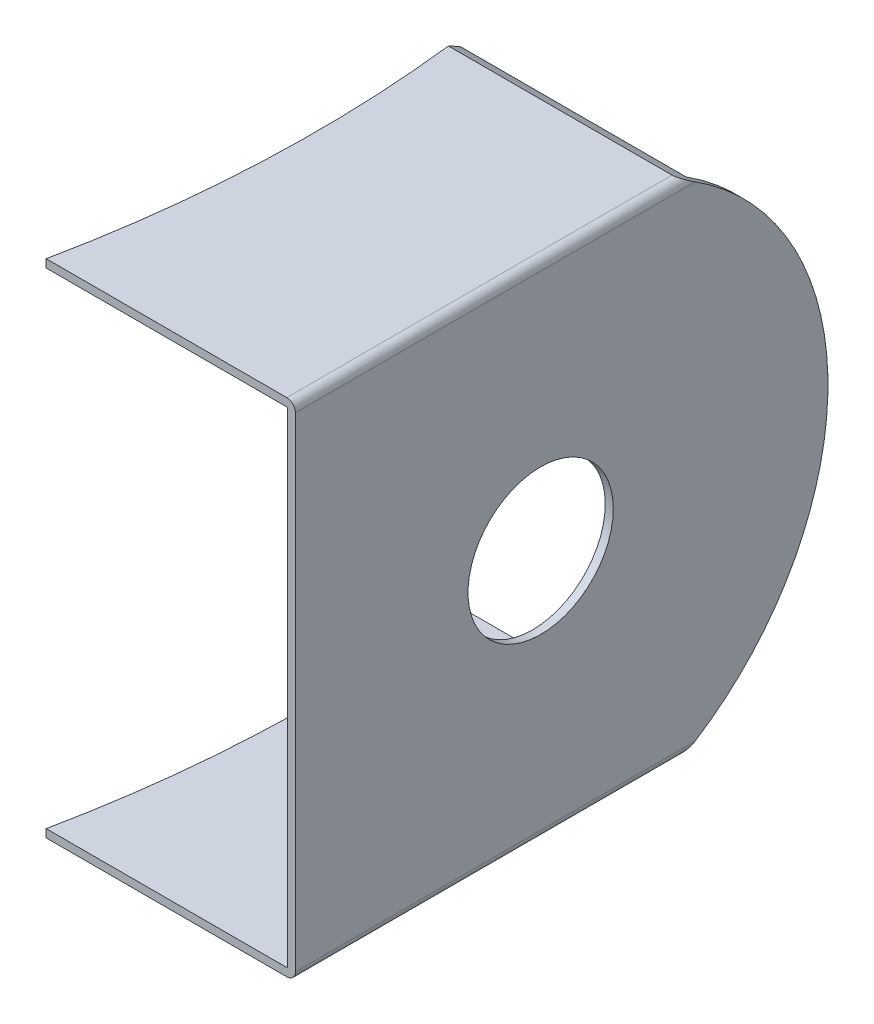
ISO-10303-21;
HEADER;
FILE_DESCRIPTION(('STEP AP214'),'2;1');
FILE_NAME('part.step','',(''),(''),'','','');
FILE_SCHEMA(('AUTOMOTIVE_DESIGN { 1 0 10303 214 1 1 1 1 }'));
ENDSEC;
DATA;
#1=APPLICATION_CONTEXT('core data for automotive mechanical design processes');
#2=APPLICATION_PROTOCOL_DEFINITION('international standard','automotive_design',2000,#1);
#3=PRODUCT_CONTEXT('',#1,'mechanical');
#4=PRODUCT('Part','Part','',(#3));
#5=PRODUCT_RELATED_PRODUCT_CATEGORY('part','',(#4));
#6=PRODUCT_DEFINITION_FORMATION('','',#4);
#7=PRODUCT_DEFINITION_CONTEXT('part definition',#1,'design');
#8=PRODUCT_DEFINITION('design','',#6,#7);
#9=PRODUCT_DEFINITION_SHAPE('','',#8);
#10=(LENGTH_UNIT() NAMED_UNIT(*) SI_UNIT(.MILLI.,.METRE.));
#11=(NAMED_UNIT(*) PLANE_ANGLE_UNIT() SI_UNIT($,.RADIAN.));
#12=(NAMED_UNIT(*) SI_UNIT($,.STERADIAN.) SOLID_ANGLE_UNIT());
#13=UNCERTAINTY_MEASURE_WITH_UNIT(LENGTH_MEASURE(1.E-05),#10,'distance_accuracy_value','');
#14=(GEOMETRIC_REPRESENTATION_CONTEXT(3) GLOBAL_UNCERTAINTY_ASSIGNED_CONTEXT((#13)) GLOBAL_UNIT_ASSIGNED_CONTEXT((#10,
#11,#12)) REPRESENTATION_CONTEXT('',''));
#15=CARTESIAN_POINT('',(0.,0.,0.));
#16=DIRECTION('',(0.,0.,1.));
#17=DIRECTION('',(1.,0.,0.));
#18=AXIS2_PLACEMENT_3D('',#15,#16,#17);
#19=CARTESIAN_POINT('',(-2.5,0.,0.));
#20=DIRECTION('',(-1.,0.,0.));
#21=DIRECTION('',(0.,0.,1.));
#22=AXIS2_PLACEMENT_3D('',#19,#20,#21);
#23=PLANE('',#22);
#24=CARTESIAN_POINT('',(-2.5,0.,-265.));
#25=DIRECTION('',(-1.,0.,0.));
#26=DIRECTION('',(0.,0.,1.));
#27=AXIS2_PLACEMENT_3D('',#24,#25,#26);
#28=CIRCLE('',#27,22.5);
#29=CARTESIAN_POINT('',(-2.5,0.,-242.5));
#30=VERTEX_POINT('',#29);
#31=EDGE_CURVE('E207',#30,#30,#28,.T.);
#32=ORIENTED_EDGE('',*,*,#31,.F.);
#33=EDGE_LOOP('',(#32));
#34=FACE_BOUND('',#33,.T.);
#35=CARTESIAN_POINT('',(-2.5,0.,-265.));
#36=DIRECTION('',(-1.,0.,0.));
#37=DIRECTION('',(0.,0.,1.));
#38=AXIS2_PLACEMENT_3D('',#35,#36,#37);
#39=CIRCLE('',#38,89.);
#40=CARTESIAN_POINT('',(-2.5,-75.,-312.916594202844));
#41=VERTEX_POINT('',#40);
#42=CARTESIAN_POINT('',(-2.5,75.,-312.916594202844));
#43=VERTEX_POINT('',#42);
#44=EDGE_CURVE('E286',#41,#43,#39,.F.);
#45=ORIENTED_EDGE('',*,*,#44,.F.);
#46=DIRECTION('',(0.,0.,-1.));
#47=VECTOR('',#46,1.);
#48=CARTESIAN_POINT('',(-2.5,-75.,365.));
#49=LINE('',#48,#47);
#50=CARTESIAN_POINT('',(-2.5,-75.,-189.039471801476));
#51=VERTEX_POINT('',#50);
#52=EDGE_CURVE('E234',#51,#41,#49,.T.);
#53=ORIENTED_EDGE('',*,*,#52,.F.);
#54=DIRECTION('',(0.,-1.,0.));
#55=VECTOR('',#54,1.);
#56=CARTESIAN_POINT('',(-2.5,0.,-189.039471801476));
#57=LINE('',#56,#55);
#58=CARTESIAN_POINT('',(-2.5,75.,-189.039471801476));
#59=VERTEX_POINT('',#58);
#60=EDGE_CURVE('E365',#59,#51,#57,.T.);
#61=ORIENTED_EDGE('',*,*,#60,.F.);
#62=DIRECTION('',(0.,0.,1.));
#63=VECTOR('',#62,1.);
#64=CARTESIAN_POINT('',(-2.5,75.,365.));
#65=LINE('',#64,#63);
#66=EDGE_CURVE('E231',#43,#59,#65,.T.);
#67=ORIENTED_EDGE('',*,*,#66,.F.);
#68=EDGE_LOOP('',(#45,#53,#61,#67));
#69=FACE_BOUND('',#68,.T.);
#70=ADVANCED_FACE('F82',(#34,#69),#23,.T.);
#71=CARTESIAN_POINT('',(0.,0.,0.));
#72=DIRECTION('',(-1.,0.,0.));
#73=DIRECTION('',(0.,0.,1.));
#74=AXIS2_PLACEMENT_3D('',#71,#72,#73);
#75=PLANE('',#74);
#76=CARTESIAN_POINT('',(0.,0.,-265.));
#77=DIRECTION('',(1.,0.,0.));
#78=DIRECTION('',(0.,0.,-1.));
#79=AXIS2_PLACEMENT_3D('',#76,#77,#78);
#80=CIRCLE('',#79,22.5);
#81=CARTESIAN_POINT('',(0.,0.,-287.5));
#82=VERTEX_POINT('',#81);
#83=EDGE_CURVE('E201',#82,#82,#80,.T.);
#84=ORIENTED_EDGE('',*,*,#83,.F.);
#85=EDGE_LOOP('',(#84));
#86=FACE_BOUND('',#85,.T.);
#87=DIRECTION('',(0.,0.,-1.));
#88=VECTOR('',#87,1.);
#89=CARTESIAN_POINT('',(0.,-75.,365.));
#90=LINE('',#89,#88);
#91=CARTESIAN_POINT('',(0.,-75.,-189.039471801476));
#92=VERTEX_POINT('',#91);
#93=CARTESIAN_POINT('',(0.,-75.,-312.916594202844));
#94=VERTEX_POINT('',#93);
#95=EDGE_CURVE('E235',#92,#94,#90,.T.);
#96=ORIENTED_EDGE('',*,*,#95,.T.);
#97=CARTESIAN_POINT('',(0.,0.,-265.));
#98=DIRECTION('',(-1.,0.,0.));
#99=DIRECTION('',(0.,0.,1.));
#100=AXIS2_PLACEMENT_3D('',#97,#98,#99);
#101=CIRCLE('',#100,89.);
#102=CARTESIAN_POINT('',(0.,75.,-312.916594202844));
#103=VERTEX_POINT('',#102);
#104=EDGE_CURVE('E302',#94,#103,#101,.F.);
#105=ORIENTED_EDGE('',*,*,#104,.T.);
#106=DIRECTION('',(0.,0.,1.));
#107=VECTOR('',#106,1.);
#108=CARTESIAN_POINT('',(0.,75.,365.));
#109=LINE('',#108,#107);
#110=CARTESIAN_POINT('',(0.,75.,-189.039471801476));
#111=VERTEX_POINT('',#110);
#112=EDGE_CURVE('E227',#103,#111,#109,.T.);
#113=ORIENTED_EDGE('',*,*,#112,.T.);
#114=DIRECTION('',(0.,-1.,0.));
#115=VECTOR('',#114,1.);
#116=CARTESIAN_POINT('',(0.,0.,-189.039471801476));
#117=LINE('',#116,#115);
#118=EDGE_CURVE('E209',#111,#92,#117,.T.);
#119=ORIENTED_EDGE('',*,*,#118,.T.);
#120=EDGE_LOOP('',(#96,#105,#113,#119));
#121=FACE_BOUND('',#120,.T.);
#122=ADVANCED_FACE('F84',(#86,#121),#75,.F.);
#123=CARTESIAN_POINT('',(-2.69999999999998,75.,-365.));
#124=DIRECTION('',(0.,0.,-1.));
#125=DIRECTION('',(0.,1.,0.));
#126=AXIS2_PLACEMENT_3D('',#123,#124,#125);
#127=CYLINDRICAL_SURFACE('',#126,2.70000000000001);
#128=CARTESIAN_POINT('',(-2.69999999999987,77.7,-308.401728076195));
#129=CARTESIAN_POINT('',(-2.65984174106857,77.7000054761132,-308.401717883849));
#130=CARTESIAN_POINT('',(-2.6197052814527,77.6991034412853,-308.403333172818));
#131=CARTESIAN_POINT('',(-2.53980520822532,77.6955387905893,-308.409714035789));
#132=CARTESIAN_POINT('',(-2.50004123564927,77.6928780963616,-308.414476171313));
#133=CARTESIAN_POINT('',(-2.38257877020886,77.6824174794397,-308.433192660789));
#134=CARTESIAN_POINT('',(-2.30577201693626,77.6721362371867,-308.451582221636));
#135=CARTESIAN_POINT('',(-2.13840998950562,77.6426315917734,-308.504285477607));
#136=CARTESIAN_POINT('',(-2.04902879567052,77.6218457699447,-308.541376779199));
#137=CARTESIAN_POINT('',(-1.87803547909727,77.5733886538341,-308.627649900219));
#138=CARTESIAN_POINT('',(-1.7964614321691,77.5456857783308,-308.676887161744));
#139=CARTESIAN_POINT('',(-1.59701187561448,77.4679108816823,-308.814746794419));
#140=CARTESIAN_POINT('',(-1.4850836454055,77.4141112449714,-308.9097812655));
#141=CARTESIAN_POINT('',(-1.27860490111387,77.298622782817,-309.112772265397));
#142=CARTESIAN_POINT('',(-1.18409022644403,77.2369181204062,-309.220754705645));
#143=CARTESIAN_POINT('',(-1.01593601718416,77.1128214081418,-309.436777347634));
#144=CARTESIAN_POINT('',(-0.941283618400128,77.0507984876956,-309.544253999978));
#145=CARTESIAN_POINT('',(-0.802703646058983,76.9233141028206,-309.764047137146));
#146=CARTESIAN_POINT('',(-0.738785133111483,76.8578497940605,-309.876367611201));
#147=CARTESIAN_POINT('',(-0.620156558505718,76.7240279015436,-310.104779546486));
#148=CARTESIAN_POINT('',(-0.565483953343071,76.6556598897693,-310.220884176106));
#149=CARTESIAN_POINT('',(-0.464656302995648,76.5167722720493,-310.455496572402));
#150=CARTESIAN_POINT('',(-0.418503814466665,76.4462520276506,-310.574005048607));
#151=CARTESIAN_POINT('',(-0.311470271773224,76.2653583754462,-310.87636130187));
#152=CARTESIAN_POINT('',(-0.255853419959798,76.153780447872,-311.061362462463));
#153=CARTESIAN_POINT('',(-0.161279447431635,75.9273334662262,-311.433690328185));
#154=CARTESIAN_POINT('',(-0.122333637112953,75.8124622340254,-311.621018523692));
#155=CARTESIAN_POINT('',(-0.0608930546610722,75.5822711688357,-311.99326839316));
#156=CARTESIAN_POINT('',(-0.0381096888427095,75.4669981949599,-312.178171199399));
#157=CARTESIAN_POINT('',(-0.015280622388065,75.2927502461648,-312.455386101439));
#158=CARTESIAN_POINT('',(-0.00956196895023161,75.2344821123025,-312.547708999312));
#159=CARTESIAN_POINT('',(-0.00192392878165216,75.1175346055044,-312.732252529271));
#160=CARTESIAN_POINT('',(-4.57947224899303E-06,75.0588552285237,-312.82447316034));
#161=CARTESIAN_POINT('',(0.,75.,-312.916594202844));
#162=B_SPLINE_CURVE_WITH_KNOTS('',3,(#128,#129,#130,#131,#132,#133,#134,#135,#136,#137,#138,
#139,#140,#141,#142,#143,#144,#145,#146,#147,#148,#149,#150,#151,#152,#153,#154,#155,#156,#157,
#158,#159,#160,#161),.UNSPECIFIED.,.F.,.F.,(4,2,2,2,2,2,2,2,2,2,2,2,2,2,2,2,4),(0.,
0.120392027188299,0.240652722191111,0.478401767589166,0.773717648538522,1.07040733153262,
1.53691788742699,2.00437811250785,2.4381928964731,2.87237204814076,3.30827004349655,
3.74429862815144,4.41276982819324,5.08169383358009,5.73835060599407,6.06626088806526,
6.39417439988108),.UNSPECIFIED.);
#163=CARTESIAN_POINT('',(-2.69999999999987,77.7,-308.401728076195));
#164=VERTEX_POINT('',#163);
#165=EDGE_CURVE('E377',#164,#103,#162,.T.);
#166=ORIENTED_EDGE('',*,*,#165,.F.);
#167=DIRECTION('',(0.,0.,-1.));
#168=VECTOR('',#167,1.);
#169=CARTESIAN_POINT('',(-2.69999999999998,77.7,0.));
#170=LINE('',#169,#168);
#171=CARTESIAN_POINT('',(-2.69999999999998,77.7,-189.039471801476));
#172=VERTEX_POINT('',#171);
#173=EDGE_CURVE('E224',#172,#164,#170,.T.);
#174=ORIENTED_EDGE('',*,*,#173,.F.);
#175=CARTESIAN_POINT('',(-2.69999999999998,75.,-189.039471801476));
#176=DIRECTION('',(0.,0.,-1.));
#177=DIRECTION('',(-1.,0.,0.));
#178=AXIS2_PLACEMENT_3D('',#175,#176,#177);
#179=CIRCLE('',#178,2.70000000000001);
#180=EDGE_CURVE('E199',#111,#172,#179,.F.);
#181=ORIENTED_EDGE('',*,*,#180,.F.);
#182=ORIENTED_EDGE('',*,*,#112,.F.);
#183=EDGE_LOOP('',(#166,#174,#181,#182));
#184=FACE_BOUND('',#183,.T.);
#185=ADVANCED_FACE('F263',(#184),#127,.T.);
#186=CARTESIAN_POINT('',(-2.69999999999998,75.,-365.));
#187=DIRECTION('',(0.,0.,-1.));
#188=DIRECTION('',(0.,1.,0.));
#189=AXIS2_PLACEMENT_3D('',#186,#187,#188);
#190=CYLINDRICAL_SURFACE('',#189,0.200000000000006);
#191=DIRECTION('',(0.,0.,1.));
#192=VECTOR('',#191,1.);
#193=CARTESIAN_POINT('',(-2.70000000000004,75.2,365.));
#194=LINE('',#193,#192);
#195=CARTESIAN_POINT('',(-2.69999999999998,75.2,-189.039471801476));
#196=VERTEX_POINT('',#195);
#197=CARTESIAN_POINT('',(-2.69999999999998,75.2,-312.602100793978));
#198=VERTEX_POINT('',#197);
#199=EDGE_CURVE('E221',#196,#198,#194,.F.);
#200=ORIENTED_EDGE('',*,*,#199,.T.);
#201=CARTESIAN_POINT('',(-2.69999999999998,75.2,-312.602100793978));
#202=CARTESIAN_POINT('',(-2.69356074440796,75.2000081597546,-312.602087868224));
#203=CARTESIAN_POINT('',(-2.6871405564243,75.1996894485544,-312.602591392653));
#204=CARTESIAN_POINT('',(-2.67455867211746,75.1984726704153,-312.604513548254));
#205=CARTESIAN_POINT('',(-2.66839503066849,75.1975804389451,-312.605922962146));
#206=CARTESIAN_POINT('',(-2.65507803315628,75.1950333782778,-312.60994603715));
#207=CARTESIAN_POINT('',(-2.64800964799401,75.1932530330245,-312.61275788283));
#208=CARTESIAN_POINT('',(-2.63449025806673,75.1890998537107,-312.619316232223));
#209=CARTESIAN_POINT('',(-2.62804191392262,75.1867246113549,-312.623066534994));
#210=CARTESIAN_POINT('',(-2.61271343341614,75.180225706199,-312.633325679449));
#211=CARTESIAN_POINT('',(-2.60424696089277,75.1758243962924,-312.640271859968));
#212=CARTESIAN_POINT('',(-2.58865954876163,75.1663923286703,-312.65515232309));
#213=CARTESIAN_POINT('',(-2.58154112879142,75.1613604209051,-312.663088410904));
#214=CARTESIAN_POINT('',(-2.56358560665336,75.1469889522152,-312.685745663265));
#215=CARTESIAN_POINT('',(-2.55392106470702,75.1372293574546,-312.701122776083));
#216=CARTESIAN_POINT('',(-2.53729377265142,75.1170376674919,-312.732913295105));
#217=CARTESIAN_POINT('',(-2.53034477498693,75.1066024533928,-312.749331498938));
#218=CARTESIAN_POINT('',(-2.52025623972899,75.088155668948,-312.778332866958));
#219=CARTESIAN_POINT('',(-2.51659556886051,75.0802265551514,-312.790792020566));
#220=CARTESIAN_POINT('',(-2.5104005069982,75.0642313029192,-312.815911585961));
#221=CARTESIAN_POINT('',(-2.5078668937608,75.0561650738365,-312.828572130503));
#222=CARTESIAN_POINT('',(-2.50388851599763,75.040095804099,-312.853779797852));
#223=CARTESIAN_POINT('',(-2.50242523105902,75.0320941813387,-312.86632494786));
#224=CARTESIAN_POINT('',(-2.50048416425694,75.0160623709561,-312.891446095826));
#225=CARTESIAN_POINT('',(-2.50000485825313,75.00803224684,-312.904022015821));
#226=CARTESIAN_POINT('',(-2.49999999999995,75.,-312.916594202844));
#227=B_SPLINE_CURVE_WITH_KNOTS('',3,(#201,#202,#203,#204,#205,#206,#207,#208,#209,#210,#211,
#212,#213,#214,#215,#216,#217,#218,#219,#220,#221,#222,#223,#224,#225,#226),.UNSPECIFIED.,.F.,
.F.,(4,2,2,2,2,2,2,2,2,2,2,2,4),(0.,0.0192593530396621,0.0383257824187626,0.061634966784451,
0.085040082591011,0.120248878276498,0.155522846677884,0.217035299640928,0.278855356017726,
0.324455511713964,0.370087086392443,0.414909084578553,0.459661602905179),.UNSPECIFIED.);
#228=EDGE_CURVE('E276',#198,#43,#227,.T.);
#229=ORIENTED_EDGE('',*,*,#228,.T.);
#230=ORIENTED_EDGE('',*,*,#66,.T.);
#231=CARTESIAN_POINT('',(-2.69999999999998,75.,-189.039471801476));
#232=DIRECTION('',(0.,0.,-1.));
#233=DIRECTION('',(-1.,0.,0.));
#234=AXIS2_PLACEMENT_3D('',#231,#232,#233);
#235=CIRCLE('',#234,0.200000000000006);
#236=EDGE_CURVE('E361',#59,#196,#235,.F.);
#237=ORIENTED_EDGE('',*,*,#236,.T.);
#238=EDGE_LOOP('',(#200,#229,#230,#237));
#239=FACE_BOUND('',#238,.T.);
#240=ADVANCED_FACE('F268',(#239),#190,.F.);
#241=CARTESIAN_POINT('',(2.77555756156289E-13,77.7,0.));
#242=DIRECTION('',(0.,1.,0.));
#243=DIRECTION('',(-1.,0.,0.));
#244=AXIS2_PLACEMENT_3D('',#241,#242,#243);
#245=PLANE('',#244);
#246=CARTESIAN_POINT('',(-445.980375294033,77.7000000000016,-265.));
#247=DIRECTION('',(0.,1.,0.));
#248=DIRECTION('',(-1.,0.,0.));
#249=AXIS2_PLACEMENT_3D('',#246,#247,#248);
#250=CIRCLE('',#249,376.5);
#251=CARTESIAN_POINT('',(-77.2226660108217,77.7000000000003,-189.039471801476));
#252=VERTEX_POINT('',#251);
#253=CARTESIAN_POINT('',(-71.9903486890443,77.7000000000004,-308.401728076195));
#254=VERTEX_POINT('',#253);
#255=EDGE_CURVE('E111',#252,#254,#250,.T.);
#256=ORIENTED_EDGE('',*,*,#255,.F.);
#257=DIRECTION('',(-1.,0.,0.));
#258=VECTOR('',#257,1.);
#259=CARTESIAN_POINT('',(2.77555756156289E-13,77.7,-189.039471801476));
#260=LINE('',#259,#258);
#261=EDGE_CURVE('E190',#172,#252,#260,.T.);
#262=ORIENTED_EDGE('',*,*,#261,.F.);
#263=ORIENTED_EDGE('',*,*,#173,.T.);
#264=DIRECTION('',(1.,0.,0.));
#265=VECTOR('',#264,1.);
#266=CARTESIAN_POINT('',(-130.,77.7000000000004,-308.401728076195));
#267=LINE('',#266,#265);
#268=EDGE_CURVE('E192',#254,#164,#267,.T.);
#269=ORIENTED_EDGE('',*,*,#268,.F.);
#270=EDGE_LOOP('',(#256,#262,#263,#269));
#271=FACE_BOUND('',#270,.T.);
#272=ADVANCED_FACE('F188',(#271),#245,.T.);
#273=CARTESIAN_POINT('',(2.77555756156289E-13,75.2,0.));
#274=DIRECTION('',(0.,1.,0.));
#275=DIRECTION('',(-1.,0.,0.));
#276=AXIS2_PLACEMENT_3D('',#273,#274,#275);
#277=PLANE('',#276);
#278=DIRECTION('',(-1.,0.,0.));
#279=VECTOR('',#278,1.);
#280=CARTESIAN_POINT('',(2.77555756156289E-13,75.2,-189.039471801476));
#281=LINE('',#280,#279);
#282=CARTESIAN_POINT('',(-77.2226660108217,75.2000000000003,-189.039471801476));
#283=VERTEX_POINT('',#282);
#284=EDGE_CURVE('E356',#196,#283,#281,.T.);
#285=ORIENTED_EDGE('',*,*,#284,.T.);
#286=CARTESIAN_POINT('',(-445.980375294033,75.2000000000015,-265.));
#287=DIRECTION('',(0.,1.,0.));
#288=DIRECTION('',(-1.,0.,0.));
#289=AXIS2_PLACEMENT_3D('',#286,#287,#288);
#290=CIRCLE('',#289,376.5);
#291=CARTESIAN_POINT('',(-72.5017413670035,75.2000000000004,-312.602100793977));
#292=VERTEX_POINT('',#291);
#293=EDGE_CURVE('E178',#283,#292,#290,.T.);
#294=ORIENTED_EDGE('',*,*,#293,.T.);
#295=DIRECTION('',(1.,0.,0.));
#296=VECTOR('',#295,1.);
#297=CARTESIAN_POINT('',(-130.,75.2000000000004,-312.602100793977));
#298=LINE('',#297,#296);
#299=EDGE_CURVE('E285',#292,#198,#298,.T.);
#300=ORIENTED_EDGE('',*,*,#299,.T.);
#301=ORIENTED_EDGE('',*,*,#199,.F.);
#302=EDGE_LOOP('',(#285,#294,#300,#301));
#303=FACE_BOUND('',#302,.T.);
#304=ADVANCED_FACE('F310',(#303),#277,.F.);
#305=CARTESIAN_POINT('',(-2.70000000000004,-75.,365.));
#306=DIRECTION('',(0.,0.,1.));
#307=DIRECTION('',(0.,-1.,0.));
#308=AXIS2_PLACEMENT_3D('',#305,#306,#307);
#309=CYLINDRICAL_SURFACE('',#308,2.70000000000001);
#310=CARTESIAN_POINT('',(0.,-75.,-312.916594202844));
#311=CARTESIAN_POINT('',(-5.48315406880755E-06,-75.0615534313284,-312.820249925329));
#312=CARTESIAN_POINT('',(-0.00210431795437442,-75.122913952728,-312.723797557342));
#313=CARTESIAN_POINT('',(-0.0104562440630682,-75.2451842713042,-312.530782576569));
#314=CARTESIAN_POINT('',(-0.0167094666222142,-75.3060940541792,-312.434219960396));
#315=CARTESIAN_POINT('',(-0.0416787173237418,-75.488240162083,-312.144222668999));
#316=CARTESIAN_POINT('',(-0.0666041220879884,-75.6086938358383,-311.950790694987));
#317=CARTESIAN_POINT('',(-0.133105592482818,-75.8462911155908,-311.565986057194));
#318=CARTESIAN_POINT('',(-0.17460748624585,-75.9634470106966,-311.374608068388));
#319=CARTESIAN_POINT('',(-0.275186663854173,-76.1942049589935,-310.994482796744));
#320=CARTESIAN_POINT('',(-0.334247367463818,-76.307810253563,-310.805733207225));
#321=CARTESIAN_POINT('',(-0.430480944116504,-76.4635568188196,-310.544835238964));
#322=CARTESIAN_POINT('',(-0.459480841092597,-76.507620544854,-310.470774343927));
#323=CARTESIAN_POINT('',(-0.520769433258612,-76.5949287880894,-310.323550301138));
#324=CARTESIAN_POINT('',(-0.553057851111673,-76.6381733740083,-310.250387078262));
#325=CARTESIAN_POINT('',(-0.655437985566986,-76.7668763192897,-310.031935992275));
#326=CARTESIAN_POINT('',(-0.730844021815633,-76.8509727575857,-309.888241659645));
#327=CARTESIAN_POINT('',(-0.866564745573194,-76.9833798717041,-309.660603317542));
#328=CARTESIAN_POINT('',(-0.921858204301485,-77.033233679171,-309.574548753646));
#329=CARTESIAN_POINT('',(-1.03968524628489,-77.1305406389732,-309.405958594687));
#330=CARTESIAN_POINT('',(-1.10222325104568,-77.1779922995707,-309.323425191153));
#331=CARTESIAN_POINT('',(-1.23510674144133,-77.269484805367,-309.163731030463));
#332=CARTESIAN_POINT('',(-1.30540696867531,-77.3135431191499,-309.086542997064));
#333=CARTESIAN_POINT('',(-1.4551183562792,-77.3974199950886,-308.939123103068));
#334=CARTESIAN_POINT('',(-1.53451386478091,-77.437245620045,-308.868879668609));
#335=CARTESIAN_POINT('',(-1.68909308922559,-77.5047750414191,-308.749442574968));
#336=CARTESIAN_POINT('',(-1.76266730069056,-77.5333865948939,-308.698704452017));
#337=CARTESIAN_POINT('',(-1.91724564234326,-77.5853340005455,-308.606407201778));
#338=CARTESIAN_POINT('',(-1.9982528637252,-77.6086676436716,-308.564851918102));
#339=CARTESIAN_POINT('',(-2.16853832368201,-77.6486316631693,-308.493582556169));
#340=CARTESIAN_POINT('',(-2.25791694027911,-77.665163054478,-308.464043400064));
#341=CARTESIAN_POINT('',(-2.39546994532581,-77.6831717589382,-308.43184279697));
#342=CARTESIAN_POINT('',(-2.4418416803193,-77.6880413985335,-308.423130643608));
#343=CARTESIAN_POINT('',(-2.53536496341062,-77.6953818428264,-308.409995418962));
#344=CARTESIAN_POINT('',(-2.58251587744697,-77.6978545089019,-308.405569019563));
#345=CARTESIAN_POINT('',(-2.65317358667657,-77.6996966159089,-308.402271161887));
#346=CARTESIAN_POINT('',(-2.67658943419545,-77.7000027594894,-308.40172300444));
#347=CARTESIAN_POINT('',(-2.69999999999992,-77.7,-308.401728076195));
#348=B_SPLINE_CURVE_WITH_KNOTS('',3,(#310,#311,#312,#313,#314,#315,#316,#317,#318,#319,#320,
#321,#322,#323,#324,#325,#326,#327,#328,#329,#330,#331,#332,#333,#334,#335,#336,#337,#338,#339,
#340,#341,#342,#343,#344,#345,#346,#347),.UNSPECIFIED.,.F.,.F.,(4,2,2,2,2,2,2,2,2,2,2,2,2,2,2,2,
2,2,4),(0.,0.342941922447977,0.685894680073238,1.37290877849786,2.05688265066433,
2.74021270797351,3.01293409410221,3.28563249933315,3.83305397194938,4.17418561987683,
4.51552657588794,4.85497306730466,5.19384394777072,5.47464815793358,5.75556968112389,
6.04044571129353,6.18252906909501,6.3245020029849,6.39473975055709),.UNSPECIFIED.);
#349=CARTESIAN_POINT('',(-2.69999999999992,-77.7000000000004,-308.401728076195));
#350=VERTEX_POINT('',#349);
#351=EDGE_CURVE('E293',#94,#350,#348,.T.);
#352=ORIENTED_EDGE('',*,*,#351,.F.);
#353=ORIENTED_EDGE('',*,*,#95,.F.);
#354=CARTESIAN_POINT('',(-2.70000000000004,-75.,-189.039471801476));
#355=DIRECTION('',(0.,0.,-1.));
#356=DIRECTION('',(-1.,0.,0.));
#357=AXIS2_PLACEMENT_3D('',#354,#355,#356);
#358=CIRCLE('',#357,2.70000000000001);
#359=CARTESIAN_POINT('',(-2.69999999999998,-77.7,-189.039471801476));
#360=VERTEX_POINT('',#359);
#361=EDGE_CURVE('E349',#360,#92,#358,.F.);
#362=ORIENTED_EDGE('',*,*,#361,.F.);
#363=DIRECTION('',(0.,0.,1.));
#364=VECTOR('',#363,1.);
#365=CARTESIAN_POINT('',(-2.69999999999998,-77.7,-365.));
#366=LINE('',#365,#364);
#367=EDGE_CURVE('E217',#360,#350,#366,.F.);
#368=ORIENTED_EDGE('',*,*,#367,.T.);
#369=EDGE_LOOP('',(#352,#353,#362,#368));
#370=FACE_BOUND('',#369,.T.);
#371=ADVANCED_FACE('F304',(#370),#309,.T.);
#372=CARTESIAN_POINT('',(-2.70000000000004,-75.,365.));
#373=DIRECTION('',(0.,0.,1.));
#374=DIRECTION('',(0.,-1.,0.));
#375=AXIS2_PLACEMENT_3D('',#372,#373,#374);
#376=CYLINDRICAL_SURFACE('',#375,0.200000000000006);
#377=ORIENTED_EDGE('',*,*,#52,.T.);
#378=CARTESIAN_POINT('',(-2.5,-75.,-312.916594202844));
#379=CARTESIAN_POINT('',(-2.50000814912923,-75.009084000155,-312.902375823492));
#380=CARTESIAN_POINT('',(-2.50061950746854,-75.0181663468578,-312.888150968514));
#381=CARTESIAN_POINT('',(-2.50310586748242,-75.0362985743765,-312.859734424288));
#382=CARTESIAN_POINT('',(-2.50498448774924,-75.0453482874082,-312.84554294712));
#383=CARTESIAN_POINT('',(-2.51007460955227,-75.0633738417529,-312.81725829119));
#384=CARTESIAN_POINT('',(-2.51329207384107,-75.0723491670526,-312.803165842635));
#385=CARTESIAN_POINT('',(-2.5211792718426,-75.0900971410082,-312.775282140062));
#386=CARTESIAN_POINT('',(-2.5258469594839,-75.0988700566201,-312.761490490813));
#387=CARTESIAN_POINT('',(-2.53547249033268,-75.1139724922818,-312.737734370018));
#388=CARTESIAN_POINT('',(-2.54007224556966,-75.1203691015469,-312.727667899897));
#389=CARTESIAN_POINT('',(-2.55033486852541,-75.1329138331611,-312.707917535215));
#390=CARTESIAN_POINT('',(-2.55599788639377,-75.1390619202658,-312.698233694922));
#391=CARTESIAN_POINT('',(-2.56860406291954,-75.1510344785914,-312.679368101461));
#392=CARTESIAN_POINT('',(-2.57555693181496,-75.1568560270034,-312.670190891967));
#393=CARTESIAN_POINT('',(-2.59093439630726,-75.1679111215306,-312.652756931437));
#394=CARTESIAN_POINT('',(-2.59935534585354,-75.1731460727819,-312.644497981187));
#395=CARTESIAN_POINT('',(-2.61412385041691,-75.1807299251493,-312.632529600969));
#396=CARTESIAN_POINT('',(-2.61991956374028,-75.18338605653,-312.628336962936));
#397=CARTESIAN_POINT('',(-2.6321456163851,-75.1882525977177,-312.620654047139));
#398=CARTESIAN_POINT('',(-2.63857612406577,-75.190462888804,-312.617163956453));
#399=CARTESIAN_POINT('',(-2.65212699644398,-75.1943152286945,-312.611080333546));
#400=CARTESIAN_POINT('',(-2.65925534298853,-75.1959493961739,-312.60849923676));
#401=CARTESIAN_POINT('',(-2.67396606121453,-75.1984369927653,-312.604569943383));
#402=CARTESIAN_POINT('',(-2.68154657875853,-75.1992934042232,-312.603217037237));
#403=CARTESIAN_POINT('',(-2.69099093581039,-75.1998052488306,-312.602408453007));
#404=CARTESIAN_POINT('',(-2.69279034541174,-75.1998782112942,-312.602293190549));
#405=CARTESIAN_POINT('',(-2.6963928936869,-75.1999755091003,-312.602139484008));
#406=CARTESIAN_POINT('',(-2.69819603016301,-75.1999998677061,-312.602101003174));
#407=CARTESIAN_POINT('',(-2.69999999999998,-75.2,-312.602100793978));
#408=B_SPLINE_CURVE_WITH_KNOTS('',3,(#378,#379,#380,#381,#382,#383,#384,#385,#386,#387,#388,
#389,#390,#391,#392,#393,#394,#395,#396,#397,#398,#399,#400,#401,#402,#403,#404,#405,#406,#407),
.UNSPECIFIED.,.F.,.F.,(4,2,2,2,2,2,2,2,2,2,2,2,2,2,4),(0.,0.0506140218711541,0.101373184347091,
0.152360872170728,0.203276947361265,0.241584454468258,0.279897375279034,0.318511377440853,
0.357030811568367,0.379866462112237,0.40270818544922,0.425851252046082,0.448905195974379,
0.454317464326169,0.459727141578026),.UNSPECIFIED.);
#409=CARTESIAN_POINT('',(-2.69999999999998,-75.2000000000004,-312.602100793977));
#410=VERTEX_POINT('',#409);
#411=EDGE_CURVE('E319',#41,#410,#408,.T.);
#412=ORIENTED_EDGE('',*,*,#411,.T.);
#413=DIRECTION('',(0.,0.,1.));
#414=VECTOR('',#413,1.);
#415=CARTESIAN_POINT('',(-2.69999999999998,-75.2,-365.));
#416=LINE('',#415,#414);
#417=CARTESIAN_POINT('',(-2.69999999999998,-75.2,-189.039471801476));
#418=VERTEX_POINT('',#417);
#419=EDGE_CURVE('E216',#410,#418,#416,.T.);
#420=ORIENTED_EDGE('',*,*,#419,.T.);
#421=CARTESIAN_POINT('',(-2.70000000000004,-75.,-189.039471801476));
#422=DIRECTION('',(0.,0.,-1.));
#423=DIRECTION('',(-1.,0.,0.));
#424=AXIS2_PLACEMENT_3D('',#421,#422,#423);
#425=CIRCLE('',#424,0.200000000000006);
#426=EDGE_CURVE('E368',#418,#51,#425,.F.);
#427=ORIENTED_EDGE('',*,*,#426,.T.);
#428=EDGE_LOOP('',(#377,#412,#420,#427));
#429=FACE_BOUND('',#428,.T.);
#430=ADVANCED_FACE('F309',(#429),#376,.F.);
#431=CARTESIAN_POINT('',(2.77555756156289E-13,-77.7,0.));
#432=DIRECTION('',(0.,1.,0.));
#433=DIRECTION('',(-1.,0.,0.));
#434=AXIS2_PLACEMENT_3D('',#431,#432,#433);
#435=PLANE('',#434);
#436=DIRECTION('',(-1.,0.,0.));
#437=VECTOR('',#436,1.);
#438=CARTESIAN_POINT('',(2.77555756156289E-13,-77.7,-189.039471801476));
#439=LINE('',#438,#437);
#440=CARTESIAN_POINT('',(-77.2226660108223,-77.7000000000007,-189.039471801476));
#441=VERTEX_POINT('',#440);
#442=EDGE_CURVE('E341',#360,#441,#439,.T.);
#443=ORIENTED_EDGE('',*,*,#442,.T.);
#444=CARTESIAN_POINT('',(-445.980375294033,-77.6999999999994,-265.));
#445=DIRECTION('',(0.,1.,0.));
#446=DIRECTION('',(-1.,0.,0.));
#447=AXIS2_PLACEMENT_3D('',#444,#445,#446);
#448=CIRCLE('',#447,376.5);
#449=CARTESIAN_POINT('',(-71.9903486890448,-77.6999999999994,-308.401728076195));
#450=VERTEX_POINT('',#449);
#451=EDGE_CURVE('E194',#441,#450,#448,.T.);
#452=ORIENTED_EDGE('',*,*,#451,.T.);
#453=DIRECTION('',(1.,0.,0.));
#454=VECTOR('',#453,1.);
#455=CARTESIAN_POINT('',(-130.,-77.7000000000004,-308.401728076195));
#456=LINE('',#455,#454);
#457=EDGE_CURVE('E290',#450,#350,#456,.T.);
#458=ORIENTED_EDGE('',*,*,#457,.T.);
#459=ORIENTED_EDGE('',*,*,#367,.F.);
#460=EDGE_LOOP('',(#443,#452,#458,#459));
#461=FACE_BOUND('',#460,.T.);
#462=ADVANCED_FACE('F317',(#461),#435,.F.);
#463=CARTESIAN_POINT('',(2.77555756156289E-13,-75.2,0.));
#464=DIRECTION('',(0.,1.,0.));
#465=DIRECTION('',(-1.,0.,0.));
#466=AXIS2_PLACEMENT_3D('',#463,#464,#465);
#467=PLANE('',#466);
#468=CARTESIAN_POINT('',(-445.980375294033,-75.2000000000015,-265.));
#469=DIRECTION('',(0.,1.,0.));
#470=DIRECTION('',(-1.,0.,0.));
#471=AXIS2_PLACEMENT_3D('',#468,#469,#470);
#472=CIRCLE('',#471,376.5);
#473=CARTESIAN_POINT('',(-77.2226660108223,-75.2000000000003,-189.039471801476));
#474=VERTEX_POINT('',#473);
#475=CARTESIAN_POINT('',(-72.5017413670041,-75.2000000000004,-312.602100793977));
#476=VERTEX_POINT('',#475);
#477=EDGE_CURVE('E104',#474,#476,#472,.T.);
#478=ORIENTED_EDGE('',*,*,#477,.F.);
#479=DIRECTION('',(-1.,0.,0.));
#480=VECTOR('',#479,1.);
#481=CARTESIAN_POINT('',(2.77555756156289E-13,-75.2,-189.039471801476));
#482=LINE('',#481,#480);
#483=EDGE_CURVE('E372',#418,#474,#482,.T.);
#484=ORIENTED_EDGE('',*,*,#483,.F.);
#485=ORIENTED_EDGE('',*,*,#419,.F.);
#486=DIRECTION('',(1.,0.,0.));
#487=VECTOR('',#486,1.);
#488=CARTESIAN_POINT('',(-130.,-75.2000000000004,-312.602100793977));
#489=LINE('',#488,#487);
#490=EDGE_CURVE('E327',#476,#410,#489,.T.);
#491=ORIENTED_EDGE('',*,*,#490,.F.);
#492=EDGE_LOOP('',(#478,#484,#485,#491));
#493=FACE_BOUND('',#492,.T.);
#494=ADVANCED_FACE('F312',(#493),#467,.T.);
#495=CARTESIAN_POINT('',(-10.,0.,-265.));
#496=DIRECTION('',(1.,0.,0.));
#497=DIRECTION('',(0.,0.,-1.));
#498=AXIS2_PLACEMENT_3D('',#495,#496,#497);
#499=CYLINDRICAL_SURFACE('',#498,22.5);
#500=ORIENTED_EDGE('',*,*,#31,.T.);
#501=EDGE_LOOP('',(#500));
#502=FACE_BOUND('',#501,.T.);
#503=ORIENTED_EDGE('',*,*,#83,.T.);
#504=EDGE_LOOP('',(#503));
#505=FACE_BOUND('',#504,.T.);
#506=ADVANCED_FACE('F429',(#502,#505),#499,.F.);
#507=CARTESIAN_POINT('',(-130.,122.559083392823,-189.039471801476));
#508=DIRECTION('',(0.,0.,-1.));
#509=DIRECTION('',(-1.,0.,0.));
#510=AXIS2_PLACEMENT_3D('',#507,#508,#509);
#511=PLANE('',#510);
#512=ORIENTED_EDGE('',*,*,#261,.T.);
#513=DIRECTION('',(0.,1.,0.));
#514=VECTOR('',#513,1.);
#515=CARTESIAN_POINT('',(-77.2226660108223,-77.7000000000007,-189.039471801476));
#516=LINE('',#515,#514);
#517=EDGE_CURVE('E175',#252,#283,#516,.F.);
#518=ORIENTED_EDGE('',*,*,#517,.T.);
#519=ORIENTED_EDGE('',*,*,#284,.F.);
#520=ORIENTED_EDGE('',*,*,#236,.F.);
#521=ORIENTED_EDGE('',*,*,#60,.T.);
#522=ORIENTED_EDGE('',*,*,#426,.F.);
#523=ORIENTED_EDGE('',*,*,#483,.T.);
#524=EDGE_CURVE('E184',#474,#441,#516,.F.);
#525=ORIENTED_EDGE('',*,*,#524,.T.);
#526=ORIENTED_EDGE('',*,*,#442,.F.);
#527=ORIENTED_EDGE('',*,*,#361,.T.);
#528=ORIENTED_EDGE('',*,*,#118,.F.);
#529=ORIENTED_EDGE('',*,*,#180,.T.);
#530=EDGE_LOOP('',(#512,#518,#519,#520,#521,#522,#523,#525,#526,#527,#528,#529));
#531=FACE_BOUND('',#530,.T.);
#532=ADVANCED_FACE('F196',(#531),#511,.F.);
#533=CARTESIAN_POINT('',(-130.,0.,-265.));
#534=DIRECTION('',(1.,0.,0.));
#535=DIRECTION('',(0.,0.,-1.));
#536=AXIS2_PLACEMENT_3D('',#533,#534,#535);
#537=CYLINDRICAL_SURFACE('',#536,89.);
#538=ORIENTED_EDGE('',*,*,#457,.F.);
#539=CARTESIAN_POINT('',(-71.9903486890448,-77.7000000000005,-308.401728076195));
#540=CARTESIAN_POINT('',(-72.0780106071894,-77.2780552453919,-309.157114802477));
#541=CARTESIAN_POINT('',(-72.167258719613,-76.8451981487013,-309.906162927361));
#542=CARTESIAN_POINT('',(-72.3486334879234,-75.9579965806267,-311.391064196525));
#543=CARTESIAN_POINT('',(-72.4407601287019,-75.5036522220138,-312.126917410029));
#544=CARTESIAN_POINT('',(-72.7203735167147,-74.1120972301771,-314.308886774111));
#545=CARTESIAN_POINT('',(-72.9117030599447,-73.143446444515,-315.734634605868));
#546=CARTESIAN_POINT('',(-73.3020606641871,-71.1256369262366,-318.526727285128));
#547=CARTESIAN_POINT('',(-73.501088686884,-70.0764785942813,-319.893072428207));
#548=CARTESIAN_POINT('',(-73.9048927388716,-67.8974475134423,-322.566679309424));
#549=CARTESIAN_POINT('',(-74.1096858335393,-66.7673154250332,-323.873727116973));
#550=CARTESIAN_POINT('',(-74.3157037936674,-65.600137511098,-325.146670386024));
#551=B_SPLINE_CURVE_WITH_KNOTS('',3,(#539,#540,#541,#542,#543,#544,#545,#546,#547,#548,#549,
#550),.UNSPECIFIED.,.F.,.F.,(4,2,2,2,2,4),(0.,2.60882426966857,5.21763484901932,
10.4172446879607,15.6168286517298,20.8338820644264),.UNSPECIFIED.);
#552=EDGE_CURVE('E13',#450,#476,#551,.T.);
#553=ORIENTED_EDGE('',*,*,#552,.T.);
#554=ORIENTED_EDGE('',*,*,#490,.T.);
#555=ORIENTED_EDGE('',*,*,#411,.F.);
#556=ORIENTED_EDGE('',*,*,#44,.T.);
#557=ORIENTED_EDGE('',*,*,#228,.F.);
#558=ORIENTED_EDGE('',*,*,#299,.F.);
#559=CARTESIAN_POINT('',(-74.3157037936669,65.6001375110981,-325.146670386024));
#560=CARTESIAN_POINT('',(-74.1096858335389,66.7673154250332,-323.873727116973));
#561=CARTESIAN_POINT('',(-73.9048927388711,67.8974475134423,-322.566679309424));
#562=CARTESIAN_POINT('',(-73.5010886868836,70.0764785942813,-319.893072428207));
#563=CARTESIAN_POINT('',(-73.3020606641866,71.1256369262366,-318.526727285128));
#564=CARTESIAN_POINT('',(-72.9117030599442,73.143446444515,-315.734634605868));
#565=CARTESIAN_POINT('',(-72.7203735167142,74.1120972301771,-314.308886774111));
#566=CARTESIAN_POINT('',(-72.4407601287014,75.5036522220138,-312.126917410029));
#567=CARTESIAN_POINT('',(-72.3486334879228,75.9579965806267,-311.391064196525));
#568=CARTESIAN_POINT('',(-72.1672587196124,76.8451981487013,-309.906162927361));
#569=CARTESIAN_POINT('',(-72.0780106071888,77.2780552453919,-309.157114802477));
#570=CARTESIAN_POINT('',(-71.9903486890443,77.7000000000005,-308.401728076195));
#571=B_SPLINE_CURVE_WITH_KNOTS('',3,(#559,#560,#561,#562,#563,#564,#565,#566,#567,#568,#569,
#570),.UNSPECIFIED.,.F.,.F.,(4,2,2,2,2,4),(0.,5.21705341269666,10.4166373764658,
15.6162472154072,18.2250577947579,20.8338820644264),.UNSPECIFIED.);
#572=EDGE_CURVE('E97',#292,#254,#571,.T.);
#573=ORIENTED_EDGE('',*,*,#572,.T.);
#574=ORIENTED_EDGE('',*,*,#268,.T.);
#575=ORIENTED_EDGE('',*,*,#165,.T.);
#576=ORIENTED_EDGE('',*,*,#104,.F.);
#577=ORIENTED_EDGE('',*,*,#351,.T.);
#578=EDGE_LOOP('',(#538,#553,#554,#555,#556,#557,#558,#573,#574,#575,#576,#577));
#579=FACE_BOUND('',#578,.T.);
#580=ADVANCED_FACE('F248',(#579),#537,.T.);
#581=CARTESIAN_POINT('',(-445.980375294033,-77.6999999999994,-265.));
#582=DIRECTION('',(0.,1.,0.));
#583=DIRECTION('',(-1.,0.,0.));
#584=AXIS2_PLACEMENT_3D('',#581,#582,#583);
#585=CYLINDRICAL_SURFACE('',#584,376.5);
#586=ORIENTED_EDGE('',*,*,#255,.T.);
#587=ORIENTED_EDGE('',*,*,#572,.F.);
#588=ORIENTED_EDGE('',*,*,#293,.F.);
#589=ORIENTED_EDGE('',*,*,#517,.F.);
#590=EDGE_LOOP('',(#586,#587,#588,#589));
#591=FACE_BOUND('',#590,.T.);
#592=ADVANCED_FACE('F176',(#591),#585,.F.);
#593=ORIENTED_EDGE('',*,*,#477,.T.);
#594=ORIENTED_EDGE('',*,*,#552,.F.);
#595=ORIENTED_EDGE('',*,*,#451,.F.);
#596=ORIENTED_EDGE('',*,*,#524,.F.);
#597=EDGE_LOOP('',(#593,#594,#595,#596));
#598=FACE_BOUND('',#597,.T.);
#599=ADVANCED_FACE('F251',(#598),#585,.F.);
#600=CLOSED_SHELL('',(#70,#122,#185,#240,#272,#304,#371,#430,#462,#494,#506,#532,#580,#592,#599));
#601=MANIFOLD_SOLID_BREP('B2',#600);
#602=ADVANCED_BREP_SHAPE_REPRESENTATION('',(#18,#601),#14);
#603=SHAPE_DEFINITION_REPRESENTATION(#9,#602);
ENDSEC;
END-ISO-10303-21;
